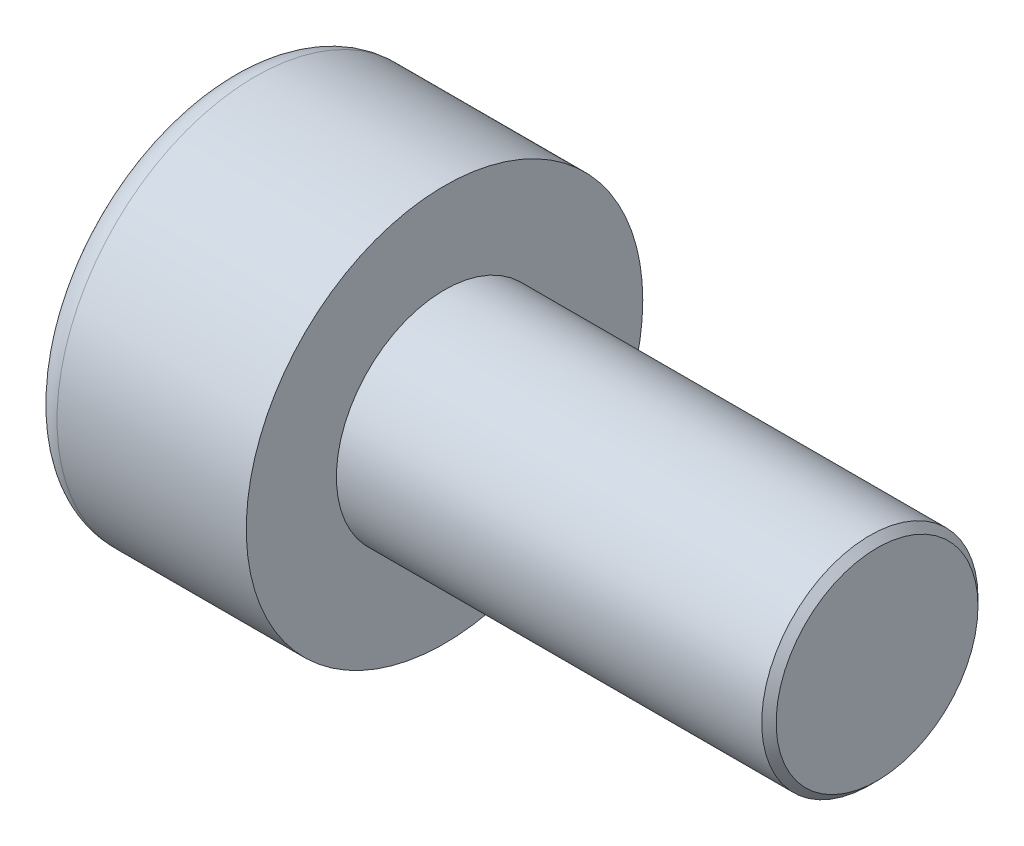
ISO-10303-21;
HEADER;
FILE_DESCRIPTION(('STEP AP214'),'2;1');
FILE_NAME('part.step','',(''),(''),'','','');
FILE_SCHEMA(('AUTOMOTIVE_DESIGN { 1 0 10303 214 1 1 1 1 }'));
ENDSEC;
DATA;
#1=APPLICATION_CONTEXT('core data for automotive mechanical design processes');
#2=APPLICATION_PROTOCOL_DEFINITION('international standard','automotive_design',2000,#1);
#3=PRODUCT_CONTEXT('',#1,'mechanical');
#4=PRODUCT('Part','Part','',(#3));
#5=PRODUCT_RELATED_PRODUCT_CATEGORY('part','',(#4));
#6=PRODUCT_DEFINITION_FORMATION('','',#4);
#7=PRODUCT_DEFINITION_CONTEXT('part definition',#1,'design');
#8=PRODUCT_DEFINITION('design','',#6,#7);
#9=PRODUCT_DEFINITION_SHAPE('','',#8);
#10=(LENGTH_UNIT() NAMED_UNIT(*) SI_UNIT(.MILLI.,.METRE.));
#11=(NAMED_UNIT(*) PLANE_ANGLE_UNIT() SI_UNIT($,.RADIAN.));
#12=(NAMED_UNIT(*) SI_UNIT($,.STERADIAN.) SOLID_ANGLE_UNIT());
#13=UNCERTAINTY_MEASURE_WITH_UNIT(LENGTH_MEASURE(1.E-05),#10,'distance_accuracy_value','');
#14=(GEOMETRIC_REPRESENTATION_CONTEXT(3) GLOBAL_UNCERTAINTY_ASSIGNED_CONTEXT((#13)) GLOBAL_UNIT_ASSIGNED_CONTEXT((#10,
#11,#12)) REPRESENTATION_CONTEXT('',''));
#15=CARTESIAN_POINT('',(0.,0.,0.));
#16=DIRECTION('',(0.,0.,1.));
#17=DIRECTION('',(1.,0.,0.));
#18=AXIS2_PLACEMENT_3D('',#15,#16,#17);
#19=CARTESIAN_POINT('',(1.3,0.,-1.44337567297406));
#20=DIRECTION('',(1.,0.,0.));
#21=DIRECTION('',(0.,0.,-1.));
#22=AXIS2_PLACEMENT_3D('',#19,#20,#21);
#23=PLANE('',#22);
#24=CARTESIAN_POINT('',(1.3,0.,0.));
#25=DIRECTION('',(1.,0.,0.));
#26=DIRECTION('',(0.,0.,-1.));
#27=AXIS2_PLACEMENT_3D('',#24,#25,#26);
#28=CIRCLE('',#27,1.25);
#29=CARTESIAN_POINT('',(1.3,-0.625,-1.08253175473055));
#30=VERTEX_POINT('',#29);
#31=CARTESIAN_POINT('',(1.3,-1.25,0.));
#32=VERTEX_POINT('',#31);
#33=EDGE_CURVE('E170',#30,#32,#28,.F.);
#34=ORIENTED_EDGE('',*,*,#33,.F.);
#35=DIRECTION('',(0.,0.866025403784439,-0.5));
#36=VECTOR('',#35,1.);
#37=CARTESIAN_POINT('',(1.3,-1.25,-0.721687836487033));
#38=LINE('',#37,#36);
#39=CARTESIAN_POINT('',(1.3,-1.25,-0.721687836487033));
#40=VERTEX_POINT('',#39);
#41=EDGE_CURVE('E179',#40,#30,#38,.T.);
#42=ORIENTED_EDGE('',*,*,#41,.F.);
#43=DIRECTION('',(0.,0.,-1.));
#44=VECTOR('',#43,1.);
#45=CARTESIAN_POINT('',(1.3,-1.25,0.721687836487032));
#46=LINE('',#45,#44);
#47=EDGE_CURVE('E193',#32,#40,#46,.T.);
#48=ORIENTED_EDGE('',*,*,#47,.F.);
#49=EDGE_LOOP('',(#34,#42,#48));
#50=FACE_BOUND('',#49,.T.);
#51=ADVANCED_FACE('F43',(#50),#23,.F.);
#52=CARTESIAN_POINT('',(1.3,-0.625,1.08253175473055));
#53=VERTEX_POINT('',#52);
#54=EDGE_CURVE('E296',#32,#53,#28,.F.);
#55=ORIENTED_EDGE('',*,*,#54,.F.);
#56=CARTESIAN_POINT('',(1.3,-1.25,0.721687836487032));
#57=VERTEX_POINT('',#56);
#58=EDGE_CURVE('E192',#57,#32,#46,.T.);
#59=ORIENTED_EDGE('',*,*,#58,.F.);
#60=DIRECTION('',(0.,-0.866025403784439,-0.5));
#61=VECTOR('',#60,1.);
#62=CARTESIAN_POINT('',(1.3,0.,1.44337567297406));
#63=LINE('',#62,#61);
#64=EDGE_CURVE('E189',#53,#57,#63,.T.);
#65=ORIENTED_EDGE('',*,*,#64,.F.);
#66=EDGE_LOOP('',(#55,#59,#65));
#67=FACE_BOUND('',#66,.T.);
#68=ADVANCED_FACE('F134',(#67),#23,.F.);
#69=CARTESIAN_POINT('',(1.3,0.625,1.08253175473055));
#70=VERTEX_POINT('',#69);
#71=EDGE_CURVE('E291',#53,#70,#28,.F.);
#72=ORIENTED_EDGE('',*,*,#71,.F.);
#73=CARTESIAN_POINT('',(1.3,0.,1.44337567297406));
#74=VERTEX_POINT('',#73);
#75=EDGE_CURVE('E187',#74,#53,#63,.T.);
#76=ORIENTED_EDGE('',*,*,#75,.F.);
#77=DIRECTION('',(0.,-0.866025403784439,0.5));
#78=VECTOR('',#77,1.);
#79=CARTESIAN_POINT('',(1.3,1.25,0.721687836487032));
#80=LINE('',#79,#78);
#81=EDGE_CURVE('E184',#70,#74,#80,.T.);
#82=ORIENTED_EDGE('',*,*,#81,.F.);
#83=EDGE_LOOP('',(#72,#76,#82));
#84=FACE_BOUND('',#83,.T.);
#85=ADVANCED_FACE('F138',(#84),#23,.F.);
#86=CARTESIAN_POINT('',(1.3,1.25,0.));
#87=VERTEX_POINT('',#86);
#88=EDGE_CURVE('E163',#70,#87,#28,.F.);
#89=ORIENTED_EDGE('',*,*,#88,.F.);
#90=CARTESIAN_POINT('',(1.3,1.25,0.721687836487032));
#91=VERTEX_POINT('',#90);
#92=EDGE_CURVE('E188',#91,#70,#80,.T.);
#93=ORIENTED_EDGE('',*,*,#92,.F.);
#94=DIRECTION('',(0.,0.,1.));
#95=VECTOR('',#94,1.);
#96=CARTESIAN_POINT('',(1.3,1.25,-0.721687836487031));
#97=LINE('',#96,#95);
#98=EDGE_CURVE('E177',#87,#91,#97,.T.);
#99=ORIENTED_EDGE('',*,*,#98,.F.);
#100=EDGE_LOOP('',(#89,#93,#99));
#101=FACE_BOUND('',#100,.T.);
#102=ADVANCED_FACE('F153',(#101),#23,.F.);
#103=CARTESIAN_POINT('',(1.3,0.,0.));
#104=DIRECTION('',(1.,0.,0.));
#105=DIRECTION('',(0.,0.,-1.));
#106=AXIS2_PLACEMENT_3D('',#103,#104,#105);
#107=CIRCLE('',#106,1.25);
#108=CARTESIAN_POINT('',(1.3,0.625,-1.08253175473055));
#109=VERTEX_POINT('',#108);
#110=EDGE_CURVE('E59',#109,#87,#107,.T.);
#111=ORIENTED_EDGE('',*,*,#110,.T.);
#112=CARTESIAN_POINT('',(1.3,1.25,-0.721687836487031));
#113=VERTEX_POINT('',#112);
#114=EDGE_CURVE('E172',#113,#87,#97,.T.);
#115=ORIENTED_EDGE('',*,*,#114,.F.);
#116=DIRECTION('',(0.,0.866025403784438,0.5));
#117=VECTOR('',#116,1.);
#118=CARTESIAN_POINT('',(1.3,0.,-1.44337567297406));
#119=LINE('',#118,#117);
#120=EDGE_CURVE('E167',#109,#113,#119,.T.);
#121=ORIENTED_EDGE('',*,*,#120,.F.);
#122=EDGE_LOOP('',(#111,#115,#121));
#123=FACE_BOUND('',#122,.T.);
#124=ADVANCED_FACE('F142',(#123),#23,.F.);
#125=EDGE_CURVE('E156',#109,#30,#28,.F.);
#126=ORIENTED_EDGE('',*,*,#125,.F.);
#127=CARTESIAN_POINT('',(1.3,0.,-1.44337567297406));
#128=VERTEX_POINT('',#127);
#129=EDGE_CURVE('E162',#128,#109,#119,.T.);
#130=ORIENTED_EDGE('',*,*,#129,.F.);
#131=EDGE_CURVE('E164',#30,#128,#38,.T.);
#132=ORIENTED_EDGE('',*,*,#131,.F.);
#133=EDGE_LOOP('',(#126,#130,#132));
#134=FACE_BOUND('',#133,.T.);
#135=ADVANCED_FACE('F133',(#134),#23,.F.);
#136=CARTESIAN_POINT('',(0.,0.,0.));
#137=DIRECTION('',(1.,0.,0.));
#138=DIRECTION('',(0.,0.,-1.));
#139=AXIS2_PLACEMENT_3D('',#136,#137,#138);
#140=PLANE('',#139);
#141=CARTESIAN_POINT('',(0.,0.,0.));
#142=DIRECTION('',(1.,0.,0.));
#143=DIRECTION('',(0.,0.,-1.));
#144=AXIS2_PLACEMENT_3D('',#141,#142,#143);
#145=CIRCLE('',#144,2.375);
#146=CARTESIAN_POINT('',(0.,0.,-2.375));
#147=VERTEX_POINT('',#146);
#148=EDGE_CURVE('E231',#147,#147,#145,.F.);
#149=ORIENTED_EDGE('',*,*,#148,.T.);
#150=EDGE_LOOP('',(#149));
#151=FACE_BOUND('',#150,.T.);
#152=DIRECTION('',(0.,0.866025403784439,-0.5));
#153=VECTOR('',#152,1.);
#154=CARTESIAN_POINT('',(0.,-1.25,-0.721687836487033));
#155=LINE('',#154,#153);
#156=CARTESIAN_POINT('',(0.,-1.25,-0.721687836487033));
#157=VERTEX_POINT('',#156);
#158=CARTESIAN_POINT('',(0.,0.,-1.44337567297406));
#159=VERTEX_POINT('',#158);
#160=EDGE_CURVE('E69',#157,#159,#155,.T.);
#161=ORIENTED_EDGE('',*,*,#160,.T.);
#162=DIRECTION('',(0.,0.866025403784438,0.5));
#163=VECTOR('',#162,1.);
#164=CARTESIAN_POINT('',(0.,0.,-1.44337567297406));
#165=LINE('',#164,#163);
#166=CARTESIAN_POINT('',(0.,1.25,-0.721687836487031));
#167=VERTEX_POINT('',#166);
#168=EDGE_CURVE('E197',#159,#167,#165,.T.);
#169=ORIENTED_EDGE('',*,*,#168,.T.);
#170=DIRECTION('',(0.,0.,1.));
#171=VECTOR('',#170,1.);
#172=CARTESIAN_POINT('',(0.,1.25,-0.721687836487031));
#173=LINE('',#172,#171);
#174=CARTESIAN_POINT('',(0.,1.25,0.721687836487032));
#175=VERTEX_POINT('',#174);
#176=EDGE_CURVE('E205',#167,#175,#173,.T.);
#177=ORIENTED_EDGE('',*,*,#176,.T.);
#178=DIRECTION('',(0.,-0.866025403784439,0.5));
#179=VECTOR('',#178,1.);
#180=CARTESIAN_POINT('',(0.,1.25,0.721687836487032));
#181=LINE('',#180,#179);
#182=CARTESIAN_POINT('',(0.,0.,1.44337567297406));
#183=VERTEX_POINT('',#182);
#184=EDGE_CURVE('E204',#175,#183,#181,.T.);
#185=ORIENTED_EDGE('',*,*,#184,.T.);
#186=DIRECTION('',(0.,-0.866025403784439,-0.5));
#187=VECTOR('',#186,1.);
#188=CARTESIAN_POINT('',(0.,0.,1.44337567297406));
#189=LINE('',#188,#187);
#190=CARTESIAN_POINT('',(0.,-1.25,0.721687836487032));
#191=VERTEX_POINT('',#190);
#192=EDGE_CURVE('E209',#183,#191,#189,.T.);
#193=ORIENTED_EDGE('',*,*,#192,.T.);
#194=DIRECTION('',(0.,0.,-1.));
#195=VECTOR('',#194,1.);
#196=CARTESIAN_POINT('',(0.,-1.25,0.721687836487032));
#197=LINE('',#196,#195);
#198=EDGE_CURVE('E212',#191,#157,#197,.T.);
#199=ORIENTED_EDGE('',*,*,#198,.T.);
#200=EDGE_LOOP('',(#161,#169,#177,#185,#193,#199));
#201=FACE_BOUND('',#200,.T.);
#202=ADVANCED_FACE('F143',(#151,#201),#140,.F.);
#203=CARTESIAN_POINT('',(3.,0.,0.));
#204=DIRECTION('',(1.,0.,0.));
#205=DIRECTION('',(0.,0.,-1.));
#206=AXIS2_PLACEMENT_3D('',#203,#204,#205);
#207=PLANE('',#206);
#208=CARTESIAN_POINT('',(3.,0.,0.));
#209=DIRECTION('',(1.,0.,0.));
#210=DIRECTION('',(0.,0.,-1.));
#211=AXIS2_PLACEMENT_3D('',#208,#209,#210);
#212=CIRCLE('',#211,2.75);
#213=CARTESIAN_POINT('',(3.,0.,-2.75));
#214=VERTEX_POINT('',#213);
#215=EDGE_CURVE('E169',#214,#214,#212,.T.);
#216=ORIENTED_EDGE('',*,*,#215,.T.);
#217=EDGE_LOOP('',(#216));
#218=FACE_BOUND('',#217,.T.);
#219=CARTESIAN_POINT('',(3.,0.,0.));
#220=DIRECTION('',(1.,0.,0.));
#221=DIRECTION('',(0.,0.,-1.));
#222=AXIS2_PLACEMENT_3D('',#219,#220,#221);
#223=CIRCLE('',#222,1.5);
#224=CARTESIAN_POINT('',(3.,0.,-1.5));
#225=VERTEX_POINT('',#224);
#226=EDGE_CURVE('E223',#225,#225,#223,.T.);
#227=ORIENTED_EDGE('',*,*,#226,.F.);
#228=EDGE_LOOP('',(#227));
#229=FACE_BOUND('',#228,.T.);
#230=ADVANCED_FACE('F154',(#218,#229),#207,.T.);
#231=CARTESIAN_POINT('',(3.,0.,0.));
#232=DIRECTION('',(-1.,0.,0.));
#233=DIRECTION('',(0.,0.,1.));
#234=AXIS2_PLACEMENT_3D('',#231,#232,#233);
#235=CYLINDRICAL_SURFACE('',#234,2.75);
#236=CARTESIAN_POINT('',(0.375,0.,0.));
#237=DIRECTION('',(1.,0.,0.));
#238=DIRECTION('',(0.,0.,-1.));
#239=AXIS2_PLACEMENT_3D('',#236,#237,#238);
#240=CIRCLE('',#239,2.75);
#241=CARTESIAN_POINT('',(0.375,0.,-2.75));
#242=VERTEX_POINT('',#241);
#243=EDGE_CURVE('E227',#242,#242,#240,.T.);
#244=ORIENTED_EDGE('',*,*,#243,.T.);
#245=EDGE_LOOP('',(#244));
#246=FACE_BOUND('',#245,.T.);
#247=ORIENTED_EDGE('',*,*,#215,.F.);
#248=EDGE_LOOP('',(#247));
#249=FACE_BOUND('',#248,.T.);
#250=ADVANCED_FACE('F249',(#246,#249),#235,.T.);
#251=CARTESIAN_POINT('',(9.,0.,0.));
#252=DIRECTION('',(-1.,0.,0.));
#253=DIRECTION('',(0.,0.,1.));
#254=AXIS2_PLACEMENT_3D('',#251,#252,#253);
#255=CYLINDRICAL_SURFACE('',#254,1.5);
#256=CARTESIAN_POINT('',(8.9,0.,0.));
#257=DIRECTION('',(1.,0.,0.));
#258=DIRECTION('',(0.,0.,-1.));
#259=AXIS2_PLACEMENT_3D('',#256,#257,#258);
#260=CIRCLE('',#259,1.5);
#261=CARTESIAN_POINT('',(8.9,0.,-1.5));
#262=VERTEX_POINT('',#261);
#263=EDGE_CURVE('E11',#262,#262,#260,.F.);
#264=ORIENTED_EDGE('',*,*,#263,.T.);
#265=EDGE_LOOP('',(#264));
#266=FACE_BOUND('',#265,.T.);
#267=ORIENTED_EDGE('',*,*,#226,.T.);
#268=EDGE_LOOP('',(#267));
#269=FACE_BOUND('',#268,.T.);
#270=ADVANCED_FACE('F250',(#266,#269),#255,.T.);
#271=CARTESIAN_POINT('',(9.,0.,0.));
#272=DIRECTION('',(1.,0.,0.));
#273=DIRECTION('',(0.,0.,-1.));
#274=AXIS2_PLACEMENT_3D('',#271,#272,#273);
#275=PLANE('',#274);
#276=CARTESIAN_POINT('',(9.,0.,0.));
#277=DIRECTION('',(1.,0.,0.));
#278=DIRECTION('',(0.,0.,-1.));
#279=AXIS2_PLACEMENT_3D('',#276,#277,#278);
#280=CIRCLE('',#279,1.4);
#281=CARTESIAN_POINT('',(9.,0.,-1.4));
#282=VERTEX_POINT('',#281);
#283=EDGE_CURVE('E51',#282,#282,#280,.T.);
#284=ORIENTED_EDGE('',*,*,#283,.T.);
#285=EDGE_LOOP('',(#284));
#286=FACE_BOUND('',#285,.T.);
#287=ADVANCED_FACE('F239',(#286),#275,.T.);
#288=CARTESIAN_POINT('',(1.3,-1.25,-0.721687836487033));
#289=DIRECTION('',(0.,0.5,0.866025403784439));
#290=DIRECTION('',(0.,-0.866025403784439,0.5));
#291=AXIS2_PLACEMENT_3D('',#288,#289,#290);
#292=PLANE('',#291);
#293=ORIENTED_EDGE('',*,*,#160,.F.);
#294=DIRECTION('',(-1.,0.,0.));
#295=VECTOR('',#294,1.);
#296=CARTESIAN_POINT('',(1.3,-1.25,-0.721687836487033));
#297=LINE('',#296,#295);
#298=EDGE_CURVE('E200',#40,#157,#297,.T.);
#299=ORIENTED_EDGE('',*,*,#298,.F.);
#300=ORIENTED_EDGE('',*,*,#41,.T.);
#301=ORIENTED_EDGE('',*,*,#131,.T.);
#302=DIRECTION('',(-1.,0.,0.));
#303=VECTOR('',#302,1.);
#304=CARTESIAN_POINT('',(1.3,0.,-1.44337567297406));
#305=LINE('',#304,#303);
#306=EDGE_CURVE('E178',#128,#159,#305,.T.);
#307=ORIENTED_EDGE('',*,*,#306,.T.);
#308=EDGE_LOOP('',(#293,#299,#300,#301,#307));
#309=FACE_BOUND('',#308,.T.);
#310=ADVANCED_FACE('F261',(#309),#292,.T.);
#311=CARTESIAN_POINT('',(1.3,0.,-1.44337567297406));
#312=DIRECTION('',(0.,-0.5,0.866025403784438));
#313=DIRECTION('',(0.,-0.866025403784438,-0.5));
#314=AXIS2_PLACEMENT_3D('',#311,#312,#313);
#315=PLANE('',#314);
#316=ORIENTED_EDGE('',*,*,#168,.F.);
#317=ORIENTED_EDGE('',*,*,#306,.F.);
#318=ORIENTED_EDGE('',*,*,#129,.T.);
#319=ORIENTED_EDGE('',*,*,#120,.T.);
#320=DIRECTION('',(-1.,0.,0.));
#321=VECTOR('',#320,1.);
#322=CARTESIAN_POINT('',(1.3,1.25,-0.721687836487031));
#323=LINE('',#322,#321);
#324=EDGE_CURVE('E221',#113,#167,#323,.T.);
#325=ORIENTED_EDGE('',*,*,#324,.T.);
#326=EDGE_LOOP('',(#316,#317,#318,#319,#325));
#327=FACE_BOUND('',#326,.T.);
#328=ADVANCED_FACE('F180',(#327),#315,.T.);
#329=CARTESIAN_POINT('',(1.3,1.25,-0.721687836487031));
#330=DIRECTION('',(0.,-1.,0.));
#331=DIRECTION('',(0.,0.,-1.));
#332=AXIS2_PLACEMENT_3D('',#329,#330,#331);
#333=PLANE('',#332);
#334=ORIENTED_EDGE('',*,*,#176,.F.);
#335=ORIENTED_EDGE('',*,*,#324,.F.);
#336=ORIENTED_EDGE('',*,*,#114,.T.);
#337=ORIENTED_EDGE('',*,*,#98,.T.);
#338=DIRECTION('',(-1.,0.,0.));
#339=VECTOR('',#338,1.);
#340=CARTESIAN_POINT('',(1.3,1.25,0.721687836487032));
#341=LINE('',#340,#339);
#342=EDGE_CURVE('E218',#91,#175,#341,.T.);
#343=ORIENTED_EDGE('',*,*,#342,.T.);
#344=EDGE_LOOP('',(#334,#335,#336,#337,#343));
#345=FACE_BOUND('',#344,.T.);
#346=ADVANCED_FACE('F270',(#345),#333,.T.);
#347=CARTESIAN_POINT('',(1.3,1.25,0.721687836487032));
#348=DIRECTION('',(0.,-0.5,-0.866025403784439));
#349=DIRECTION('',(0.,0.866025403784439,-0.5));
#350=AXIS2_PLACEMENT_3D('',#347,#348,#349);
#351=PLANE('',#350);
#352=ORIENTED_EDGE('',*,*,#184,.F.);
#353=ORIENTED_EDGE('',*,*,#342,.F.);
#354=ORIENTED_EDGE('',*,*,#92,.T.);
#355=ORIENTED_EDGE('',*,*,#81,.T.);
#356=DIRECTION('',(-1.,0.,0.));
#357=VECTOR('',#356,1.);
#358=CARTESIAN_POINT('',(1.3,0.,1.44337567297406));
#359=LINE('',#358,#357);
#360=EDGE_CURVE('E216',#74,#183,#359,.T.);
#361=ORIENTED_EDGE('',*,*,#360,.T.);
#362=EDGE_LOOP('',(#352,#353,#354,#355,#361));
#363=FACE_BOUND('',#362,.T.);
#364=ADVANCED_FACE('F269',(#363),#351,.T.);
#365=CARTESIAN_POINT('',(1.3,0.,1.44337567297406));
#366=DIRECTION('',(0.,0.5,-0.866025403784439));
#367=DIRECTION('',(0.,0.866025403784439,0.5));
#368=AXIS2_PLACEMENT_3D('',#365,#366,#367);
#369=PLANE('',#368);
#370=ORIENTED_EDGE('',*,*,#192,.F.);
#371=ORIENTED_EDGE('',*,*,#360,.F.);
#372=ORIENTED_EDGE('',*,*,#75,.T.);
#373=ORIENTED_EDGE('',*,*,#64,.T.);
#374=DIRECTION('',(-1.,0.,0.));
#375=VECTOR('',#374,1.);
#376=CARTESIAN_POINT('',(1.3,-1.25,0.721687836487032));
#377=LINE('',#376,#375);
#378=EDGE_CURVE('E213',#57,#191,#377,.T.);
#379=ORIENTED_EDGE('',*,*,#378,.T.);
#380=EDGE_LOOP('',(#370,#371,#372,#373,#379));
#381=FACE_BOUND('',#380,.T.);
#382=ADVANCED_FACE('F127',(#381),#369,.T.);
#383=CARTESIAN_POINT('',(1.3,-1.25,0.721687836487032));
#384=DIRECTION('',(0.,1.,0.));
#385=DIRECTION('',(0.,0.,1.));
#386=AXIS2_PLACEMENT_3D('',#383,#384,#385);
#387=PLANE('',#386);
#388=ORIENTED_EDGE('',*,*,#198,.F.);
#389=ORIENTED_EDGE('',*,*,#378,.F.);
#390=ORIENTED_EDGE('',*,*,#58,.T.);
#391=ORIENTED_EDGE('',*,*,#47,.T.);
#392=ORIENTED_EDGE('',*,*,#298,.T.);
#393=EDGE_LOOP('',(#388,#389,#390,#391,#392));
#394=FACE_BOUND('',#393,.T.);
#395=ADVANCED_FACE('F119',(#394),#387,.T.);
#396=CARTESIAN_POINT('',(1.3,0.,0.));
#397=DIRECTION('',(-1.,0.,0.));
#398=DIRECTION('',(0.,0.,1.));
#399=AXIS2_PLACEMENT_3D('',#396,#397,#398);
#400=CONICAL_SURFACE('',#399,1.25,1.04719755119659);
#401=CARTESIAN_POINT('',(2.02168783648704,0.,0.));
#402=VERTEX_POINT('',#401);
#403=VERTEX_LOOP('',#402);
#404=FACE_BOUND('',#403,.T.);
#405=ORIENTED_EDGE('',*,*,#110,.F.);
#406=ORIENTED_EDGE('',*,*,#125,.T.);
#407=ORIENTED_EDGE('',*,*,#33,.T.);
#408=ORIENTED_EDGE('',*,*,#54,.T.);
#409=ORIENTED_EDGE('',*,*,#71,.T.);
#410=ORIENTED_EDGE('',*,*,#88,.T.);
#411=EDGE_LOOP('',(#405,#406,#407,#408,#409,#410));
#412=FACE_BOUND('',#411,.T.);
#413=ADVANCED_FACE('F120',(#404,#412),#400,.F.);
#414=CARTESIAN_POINT('',(0.375,0.,0.));
#415=DIRECTION('',(1.,0.,0.));
#416=DIRECTION('',(0.,0.,-1.));
#417=AXIS2_PLACEMENT_3D('',#414,#415,#416);
#418=TOROIDAL_SURFACE('',#417,2.375,0.375);
#419=ORIENTED_EDGE('',*,*,#148,.F.);
#420=EDGE_LOOP('',(#419));
#421=FACE_BOUND('',#420,.T.);
#422=ORIENTED_EDGE('',*,*,#243,.F.);
#423=EDGE_LOOP('',(#422));
#424=FACE_BOUND('',#423,.T.);
#425=ADVANCED_FACE('F117',(#421,#424),#418,.T.);
#426=CARTESIAN_POINT('',(9.,0.,0.));
#427=DIRECTION('',(-1.,0.,0.));
#428=DIRECTION('',(0.,0.,1.));
#429=AXIS2_PLACEMENT_3D('',#426,#427,#428);
#430=CONICAL_SURFACE('',#429,1.4,0.785398163397452);
#431=ORIENTED_EDGE('',*,*,#263,.F.);
#432=EDGE_LOOP('',(#431));
#433=FACE_BOUND('',#432,.T.);
#434=ORIENTED_EDGE('',*,*,#283,.F.);
#435=EDGE_LOOP('',(#434));
#436=FACE_BOUND('',#435,.T.);
#437=ADVANCED_FACE('F44',(#433,#436),#430,.T.);
#438=CLOSED_SHELL('',(#51,#68,#85,#102,#124,#135,#202,#230,#250,#270,#287,#310,#328,#346,#364,
#382,#395,#413,#425,#437));
#439=MANIFOLD_SOLID_BREP('B2',#438);
#440=ADVANCED_BREP_SHAPE_REPRESENTATION('',(#18,#439),#14);
#441=SHAPE_DEFINITION_REPRESENTATION(#9,#440);
ENDSEC;
END-ISO-10303-21;
